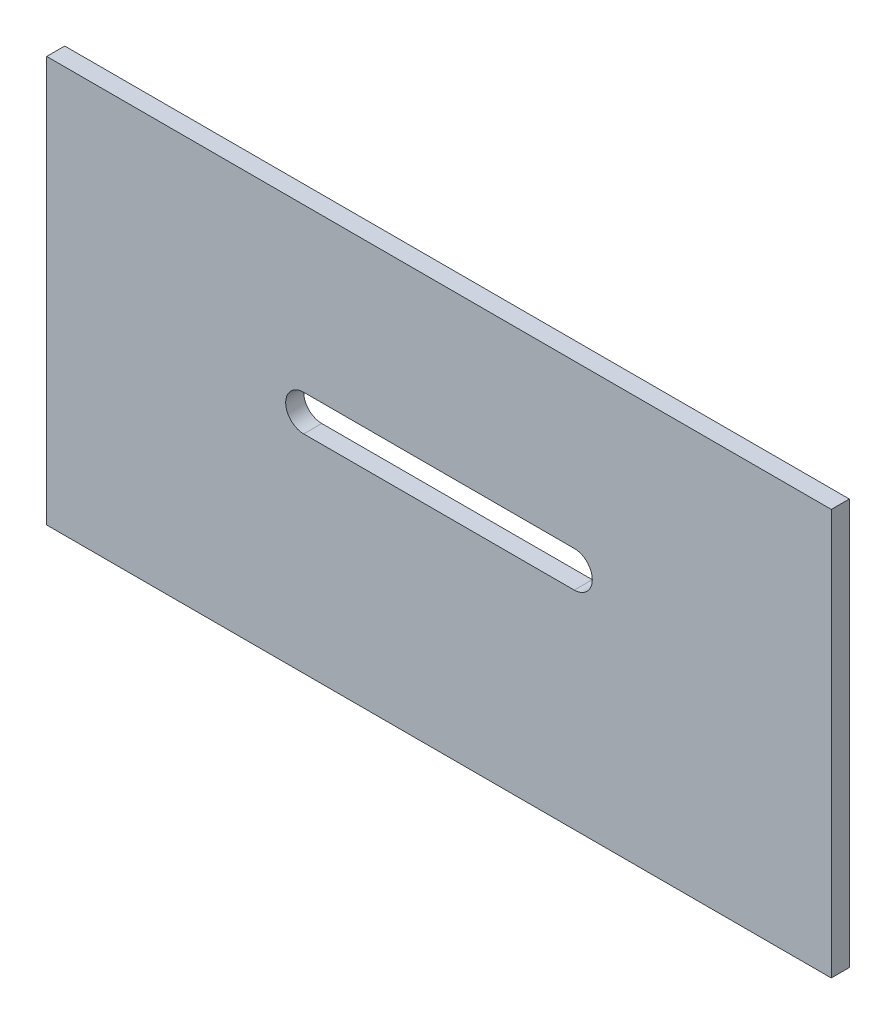
ISO-10303-21;
HEADER;
FILE_DESCRIPTION(('STEP AP214'),'2;1');
FILE_NAME('part.step','',(''),(''),'','','');
FILE_SCHEMA(('AUTOMOTIVE_DESIGN { 1 0 10303 214 1 1 1 1 }'));
ENDSEC;
DATA;
#1=APPLICATION_CONTEXT('core data for automotive mechanical design processes');
#2=APPLICATION_PROTOCOL_DEFINITION('international standard','automotive_design',2000,#1);
#3=PRODUCT_CONTEXT('',#1,'mechanical');
#4=PRODUCT('Part','Part','',(#3));
#5=PRODUCT_RELATED_PRODUCT_CATEGORY('part','',(#4));
#6=PRODUCT_DEFINITION_FORMATION('','',#4);
#7=PRODUCT_DEFINITION_CONTEXT('part definition',#1,'design');
#8=PRODUCT_DEFINITION('design','',#6,#7);
#9=PRODUCT_DEFINITION_SHAPE('','',#8);
#10=(LENGTH_UNIT() NAMED_UNIT(*) SI_UNIT(.MILLI.,.METRE.));
#11=(NAMED_UNIT(*) PLANE_ANGLE_UNIT() SI_UNIT($,.RADIAN.));
#12=(NAMED_UNIT(*) SI_UNIT($,.STERADIAN.) SOLID_ANGLE_UNIT());
#13=UNCERTAINTY_MEASURE_WITH_UNIT(LENGTH_MEASURE(1.E-05),#10,'distance_accuracy_value','');
#14=(GEOMETRIC_REPRESENTATION_CONTEXT(3) GLOBAL_UNCERTAINTY_ASSIGNED_CONTEXT((#13)) GLOBAL_UNIT_ASSIGNED_CONTEXT((#10,
#11,#12)) REPRESENTATION_CONTEXT('',''));
#15=CARTESIAN_POINT('',(0.,0.,0.));
#16=DIRECTION('',(0.,0.,1.));
#17=DIRECTION('',(1.,0.,0.));
#18=AXIS2_PLACEMENT_3D('',#15,#16,#17);
#19=CARTESIAN_POINT('',(43.5,22.5,2.));
#20=DIRECTION('',(-1.,0.,0.));
#21=DIRECTION('',(0.,0.,1.));
#22=AXIS2_PLACEMENT_3D('',#19,#20,#21);
#23=PLANE('',#22);
#24=DIRECTION('',(0.,1.,0.));
#25=VECTOR('',#24,1.);
#26=CARTESIAN_POINT('',(43.5,22.5,0.));
#27=LINE('',#26,#25);
#28=CARTESIAN_POINT('',(43.5,-22.5,0.));
#29=VERTEX_POINT('',#28);
#30=CARTESIAN_POINT('',(43.5,22.5,0.));
#31=VERTEX_POINT('',#30);
#32=EDGE_CURVE('E131',#29,#31,#27,.T.);
#33=ORIENTED_EDGE('',*,*,#32,.T.);
#34=DIRECTION('',(0.,0.,-1.));
#35=VECTOR('',#34,1.);
#36=CARTESIAN_POINT('',(43.5,22.5,2.));
#37=LINE('',#36,#35);
#38=CARTESIAN_POINT('',(43.5,22.5,2.));
#39=VERTEX_POINT('',#38);
#40=EDGE_CURVE('E11',#39,#31,#37,.T.);
#41=ORIENTED_EDGE('',*,*,#40,.F.);
#42=DIRECTION('',(0.,1.,0.));
#43=VECTOR('',#42,1.);
#44=CARTESIAN_POINT('',(43.5,22.5,2.));
#45=LINE('',#44,#43);
#46=CARTESIAN_POINT('',(43.5,-22.5,2.));
#47=VERTEX_POINT('',#46);
#48=EDGE_CURVE('E135',#47,#39,#45,.T.);
#49=ORIENTED_EDGE('',*,*,#48,.F.);
#50=DIRECTION('',(0.,0.,-1.));
#51=VECTOR('',#50,1.);
#52=CARTESIAN_POINT('',(43.5,-22.5,2.));
#53=LINE('',#52,#51);
#54=EDGE_CURVE('E145',#47,#29,#53,.T.);
#55=ORIENTED_EDGE('',*,*,#54,.T.);
#56=EDGE_LOOP('',(#33,#41,#49,#55));
#57=FACE_BOUND('',#56,.T.);
#58=ADVANCED_FACE('F34',(#57),#23,.F.);
#59=CARTESIAN_POINT('',(-43.5,22.5,2.));
#60=DIRECTION('',(0.,-1.,0.));
#61=DIRECTION('',(0.,0.,-1.));
#62=AXIS2_PLACEMENT_3D('',#59,#60,#61);
#63=PLANE('',#62);
#64=DIRECTION('',(-1.,0.,0.));
#65=VECTOR('',#64,1.);
#66=CARTESIAN_POINT('',(-43.5,22.5,0.));
#67=LINE('',#66,#65);
#68=CARTESIAN_POINT('',(-43.5,22.5,0.));
#69=VERTEX_POINT('',#68);
#70=EDGE_CURVE('E148',#31,#69,#67,.T.);
#71=ORIENTED_EDGE('',*,*,#70,.T.);
#72=DIRECTION('',(0.,0.,-1.));
#73=VECTOR('',#72,1.);
#74=CARTESIAN_POINT('',(-43.5,22.5,2.));
#75=LINE('',#74,#73);
#76=CARTESIAN_POINT('',(-43.5,22.5,2.));
#77=VERTEX_POINT('',#76);
#78=EDGE_CURVE('E41',#77,#69,#75,.T.);
#79=ORIENTED_EDGE('',*,*,#78,.F.);
#80=DIRECTION('',(-1.,0.,0.));
#81=VECTOR('',#80,1.);
#82=CARTESIAN_POINT('',(-43.5,22.5,2.));
#83=LINE('',#82,#81);
#84=EDGE_CURVE('E138',#39,#77,#83,.T.);
#85=ORIENTED_EDGE('',*,*,#84,.F.);
#86=ORIENTED_EDGE('',*,*,#40,.T.);
#87=EDGE_LOOP('',(#71,#79,#85,#86));
#88=FACE_BOUND('',#87,.T.);
#89=ADVANCED_FACE('F176',(#88),#63,.F.);
#90=CARTESIAN_POINT('',(-43.5,22.5,2.));
#91=DIRECTION('',(1.,0.,0.));
#92=DIRECTION('',(0.,0.,-1.));
#93=AXIS2_PLACEMENT_3D('',#90,#91,#92);
#94=PLANE('',#93);
#95=DIRECTION('',(0.,-1.,0.));
#96=VECTOR('',#95,1.);
#97=CARTESIAN_POINT('',(-43.5,22.5,0.));
#98=LINE('',#97,#96);
#99=CARTESIAN_POINT('',(-43.5,-22.5,0.));
#100=VERTEX_POINT('',#99);
#101=EDGE_CURVE('E150',#69,#100,#98,.T.);
#102=ORIENTED_EDGE('',*,*,#101,.T.);
#103=DIRECTION('',(0.,0.,-1.));
#104=VECTOR('',#103,1.);
#105=CARTESIAN_POINT('',(-43.5,-22.5,2.));
#106=LINE('',#105,#104);
#107=CARTESIAN_POINT('',(-43.5,-22.5,2.));
#108=VERTEX_POINT('',#107);
#109=EDGE_CURVE('E155',#108,#100,#106,.T.);
#110=ORIENTED_EDGE('',*,*,#109,.F.);
#111=DIRECTION('',(0.,-1.,0.));
#112=VECTOR('',#111,1.);
#113=CARTESIAN_POINT('',(-43.5,22.5,2.));
#114=LINE('',#113,#112);
#115=EDGE_CURVE('E141',#77,#108,#114,.T.);
#116=ORIENTED_EDGE('',*,*,#115,.F.);
#117=ORIENTED_EDGE('',*,*,#78,.T.);
#118=EDGE_LOOP('',(#102,#110,#116,#117));
#119=FACE_BOUND('',#118,.T.);
#120=ADVANCED_FACE('F162',(#119),#94,.F.);
#121=CARTESIAN_POINT('',(-43.5,-22.5,2.));
#122=DIRECTION('',(0.,1.,0.));
#123=DIRECTION('',(0.,0.,1.));
#124=AXIS2_PLACEMENT_3D('',#121,#122,#123);
#125=PLANE('',#124);
#126=DIRECTION('',(1.,0.,0.));
#127=VECTOR('',#126,1.);
#128=CARTESIAN_POINT('',(-43.5,-22.5,0.));
#129=LINE('',#128,#127);
#130=EDGE_CURVE('E139',#100,#29,#129,.T.);
#131=ORIENTED_EDGE('',*,*,#130,.T.);
#132=ORIENTED_EDGE('',*,*,#54,.F.);
#133=DIRECTION('',(1.,0.,0.));
#134=VECTOR('',#133,1.);
#135=CARTESIAN_POINT('',(-43.5,-22.5,2.));
#136=LINE('',#135,#134);
#137=EDGE_CURVE('E143',#108,#47,#136,.T.);
#138=ORIENTED_EDGE('',*,*,#137,.F.);
#139=ORIENTED_EDGE('',*,*,#109,.T.);
#140=EDGE_LOOP('',(#131,#132,#138,#139));
#141=FACE_BOUND('',#140,.T.);
#142=ADVANCED_FACE('F169',(#141),#125,.F.);
#143=CARTESIAN_POINT('',(0.,0.,2.));
#144=DIRECTION('',(0.,0.,1.));
#145=DIRECTION('',(1.,0.,0.));
#146=AXIS2_PLACEMENT_3D('',#143,#144,#145);
#147=PLANE('',#146);
#148=CARTESIAN_POINT('',(-15.,2.5,2.));
#149=DIRECTION('',(0.,0.,1.));
#150=DIRECTION('',(1.,0.,0.));
#151=AXIS2_PLACEMENT_3D('',#148,#149,#150);
#152=CIRCLE('',#151,2.);
#153=CARTESIAN_POINT('',(-15.,4.5,2.));
#154=VERTEX_POINT('',#153);
#155=CARTESIAN_POINT('',(-15.,0.499999999999995,2.));
#156=VERTEX_POINT('',#155);
#157=EDGE_CURVE('E48',#154,#156,#152,.T.);
#158=ORIENTED_EDGE('',*,*,#157,.F.);
#159=DIRECTION('',(-1.,0.,0.));
#160=VECTOR('',#159,1.);
#161=CARTESIAN_POINT('',(-15.,4.5,2.));
#162=LINE('',#161,#160);
#163=CARTESIAN_POINT('',(15.,4.50000000000001,2.));
#164=VERTEX_POINT('',#163);
#165=EDGE_CURVE('E116',#164,#154,#162,.T.);
#166=ORIENTED_EDGE('',*,*,#165,.F.);
#167=CARTESIAN_POINT('',(15.,2.50000000000001,2.));
#168=DIRECTION('',(0.,0.,1.));
#169=DIRECTION('',(1.,0.,0.));
#170=AXIS2_PLACEMENT_3D('',#167,#168,#169);
#171=CIRCLE('',#170,2.);
#172=CARTESIAN_POINT('',(15.,0.500000000000007,2.));
#173=VERTEX_POINT('',#172);
#174=EDGE_CURVE('E119',#173,#164,#171,.T.);
#175=ORIENTED_EDGE('',*,*,#174,.F.);
#176=DIRECTION('',(1.,0.,0.));
#177=VECTOR('',#176,1.);
#178=CARTESIAN_POINT('',(-15.,0.499999999999995,2.));
#179=LINE('',#178,#177);
#180=EDGE_CURVE('E125',#156,#173,#179,.T.);
#181=ORIENTED_EDGE('',*,*,#180,.F.);
#182=EDGE_LOOP('',(#158,#166,#175,#181));
#183=FACE_BOUND('',#182,.T.);
#184=ORIENTED_EDGE('',*,*,#48,.T.);
#185=ORIENTED_EDGE('',*,*,#84,.T.);
#186=ORIENTED_EDGE('',*,*,#115,.T.);
#187=ORIENTED_EDGE('',*,*,#137,.T.);
#188=EDGE_LOOP('',(#184,#185,#186,#187));
#189=FACE_BOUND('',#188,.T.);
#190=ADVANCED_FACE('F175',(#183,#189),#147,.T.);
#191=CARTESIAN_POINT('',(0.,0.,0.));
#192=DIRECTION('',(0.,0.,1.));
#193=DIRECTION('',(1.,0.,0.));
#194=AXIS2_PLACEMENT_3D('',#191,#192,#193);
#195=PLANE('',#194);
#196=DIRECTION('',(-1.,0.,0.));
#197=VECTOR('',#196,1.);
#198=CARTESIAN_POINT('',(-15.,4.5,0.));
#199=LINE('',#198,#197);
#200=CARTESIAN_POINT('',(15.,4.50000000000001,0.));
#201=VERTEX_POINT('',#200);
#202=CARTESIAN_POINT('',(-15.,4.5,0.));
#203=VERTEX_POINT('',#202);
#204=EDGE_CURVE('E106',#201,#203,#199,.T.);
#205=ORIENTED_EDGE('',*,*,#204,.T.);
#206=CARTESIAN_POINT('',(-15.,2.5,0.));
#207=DIRECTION('',(0.,0.,1.));
#208=DIRECTION('',(1.,0.,0.));
#209=AXIS2_PLACEMENT_3D('',#206,#207,#208);
#210=CIRCLE('',#209,2.);
#211=CARTESIAN_POINT('',(-15.,0.499999999999995,0.));
#212=VERTEX_POINT('',#211);
#213=EDGE_CURVE('E100',#203,#212,#210,.T.);
#214=ORIENTED_EDGE('',*,*,#213,.T.);
#215=DIRECTION('',(1.,0.,0.));
#216=VECTOR('',#215,1.);
#217=CARTESIAN_POINT('',(-15.,0.499999999999995,0.));
#218=LINE('',#217,#216);
#219=CARTESIAN_POINT('',(15.,0.500000000000006,0.));
#220=VERTEX_POINT('',#219);
#221=EDGE_CURVE('E109',#212,#220,#218,.T.);
#222=ORIENTED_EDGE('',*,*,#221,.T.);
#223=CARTESIAN_POINT('',(15.,2.50000000000001,0.));
#224=DIRECTION('',(0.,0.,1.));
#225=DIRECTION('',(1.,0.,0.));
#226=AXIS2_PLACEMENT_3D('',#223,#224,#225);
#227=CIRCLE('',#226,2.);
#228=EDGE_CURVE('E56',#220,#201,#227,.T.);
#229=ORIENTED_EDGE('',*,*,#228,.T.);
#230=EDGE_LOOP('',(#205,#214,#222,#229));
#231=FACE_BOUND('',#230,.T.);
#232=ORIENTED_EDGE('',*,*,#32,.F.);
#233=ORIENTED_EDGE('',*,*,#130,.F.);
#234=ORIENTED_EDGE('',*,*,#101,.F.);
#235=ORIENTED_EDGE('',*,*,#70,.F.);
#236=EDGE_LOOP('',(#232,#233,#234,#235));
#237=FACE_BOUND('',#236,.T.);
#238=ADVANCED_FACE('F113',(#231,#237),#195,.F.);
#239=CARTESIAN_POINT('',(-15.,2.5,0.));
#240=DIRECTION('',(0.,0.,1.));
#241=DIRECTION('',(1.,0.,0.));
#242=AXIS2_PLACEMENT_3D('',#239,#240,#241);
#243=CYLINDRICAL_SURFACE('',#242,2.);
#244=ORIENTED_EDGE('',*,*,#157,.T.);
#245=DIRECTION('',(0.,0.,1.));
#246=VECTOR('',#245,1.);
#247=CARTESIAN_POINT('',(-15.,0.499999999999995,0.));
#248=LINE('',#247,#246);
#249=EDGE_CURVE('E96',#212,#156,#248,.T.);
#250=ORIENTED_EDGE('',*,*,#249,.F.);
#251=ORIENTED_EDGE('',*,*,#213,.F.);
#252=DIRECTION('',(0.,0.,1.));
#253=VECTOR('',#252,1.);
#254=CARTESIAN_POINT('',(-15.,4.5,0.));
#255=LINE('',#254,#253);
#256=EDGE_CURVE('E129',#203,#154,#255,.T.);
#257=ORIENTED_EDGE('',*,*,#256,.T.);
#258=EDGE_LOOP('',(#244,#250,#251,#257));
#259=FACE_BOUND('',#258,.T.);
#260=ADVANCED_FACE('F98',(#259),#243,.F.);
#261=CARTESIAN_POINT('',(-15.,4.5,0.));
#262=DIRECTION('',(0.,1.,0.));
#263=DIRECTION('',(-1.,0.,0.));
#264=AXIS2_PLACEMENT_3D('',#261,#262,#263);
#265=PLANE('',#264);
#266=ORIENTED_EDGE('',*,*,#165,.T.);
#267=ORIENTED_EDGE('',*,*,#256,.F.);
#268=ORIENTED_EDGE('',*,*,#204,.F.);
#269=DIRECTION('',(0.,0.,1.));
#270=VECTOR('',#269,1.);
#271=CARTESIAN_POINT('',(15.,4.50000000000001,0.));
#272=LINE('',#271,#270);
#273=EDGE_CURVE('E132',#201,#164,#272,.T.);
#274=ORIENTED_EDGE('',*,*,#273,.T.);
#275=EDGE_LOOP('',(#266,#267,#268,#274));
#276=FACE_BOUND('',#275,.T.);
#277=ADVANCED_FACE('F193',(#276),#265,.F.);
#278=CARTESIAN_POINT('',(15.,2.50000000000001,0.));
#279=DIRECTION('',(0.,0.,1.));
#280=DIRECTION('',(1.,0.,0.));
#281=AXIS2_PLACEMENT_3D('',#278,#279,#280);
#282=CYLINDRICAL_SURFACE('',#281,2.);
#283=ORIENTED_EDGE('',*,*,#174,.T.);
#284=ORIENTED_EDGE('',*,*,#273,.F.);
#285=ORIENTED_EDGE('',*,*,#228,.F.);
#286=DIRECTION('',(0.,0.,1.));
#287=VECTOR('',#286,1.);
#288=CARTESIAN_POINT('',(15.,0.500000000000007,0.));
#289=LINE('',#288,#287);
#290=EDGE_CURVE('E105',#220,#173,#289,.T.);
#291=ORIENTED_EDGE('',*,*,#290,.T.);
#292=EDGE_LOOP('',(#283,#284,#285,#291));
#293=FACE_BOUND('',#292,.T.);
#294=ADVANCED_FACE('F196',(#293),#282,.F.);
#295=CARTESIAN_POINT('',(-15.,0.499999999999995,0.));
#296=DIRECTION('',(0.,-1.,0.));
#297=DIRECTION('',(1.,0.,0.));
#298=AXIS2_PLACEMENT_3D('',#295,#296,#297);
#299=PLANE('',#298);
#300=ORIENTED_EDGE('',*,*,#180,.T.);
#301=ORIENTED_EDGE('',*,*,#290,.F.);
#302=ORIENTED_EDGE('',*,*,#221,.F.);
#303=ORIENTED_EDGE('',*,*,#249,.T.);
#304=EDGE_LOOP('',(#300,#301,#302,#303));
#305=FACE_BOUND('',#304,.T.);
#306=ADVANCED_FACE('F110',(#305),#299,.F.);
#307=CLOSED_SHELL('',(#58,#89,#120,#142,#190,#238,#260,#277,#294,#306));
#308=MANIFOLD_SOLID_BREP('B2',#307);
#309=ADVANCED_BREP_SHAPE_REPRESENTATION('',(#18,#308),#14);
#310=SHAPE_DEFINITION_REPRESENTATION(#9,#309);
ENDSEC;
END-ISO-10303-21;
